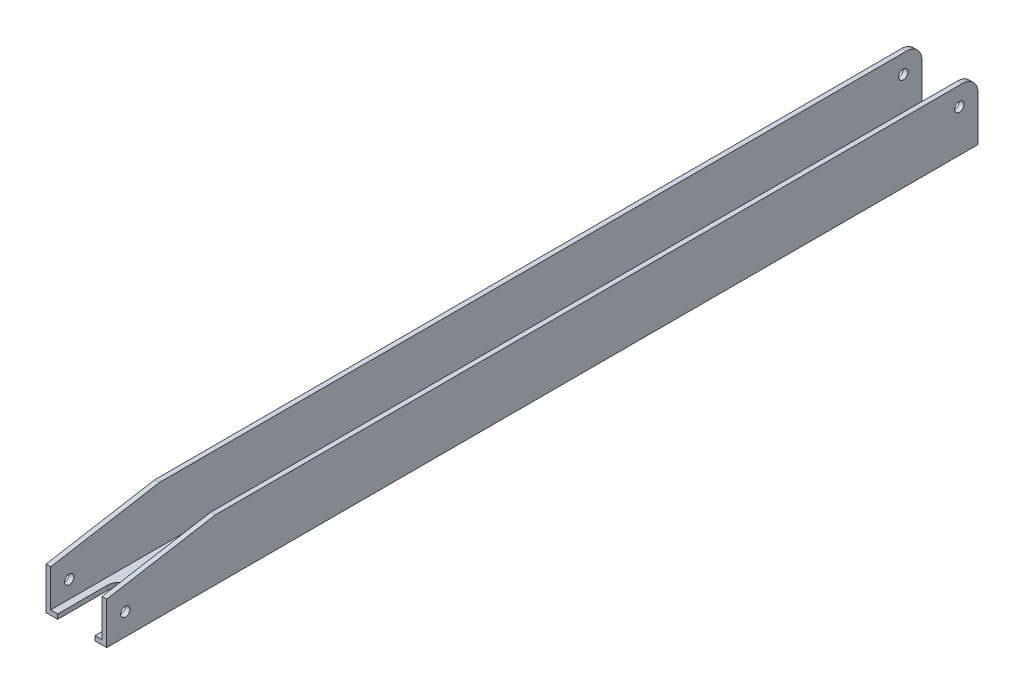
ISO-10303-21;
HEADER;
FILE_DESCRIPTION(('STEP AP214'),'2;1');
FILE_NAME('part.step','',(''),(''),'','','');
FILE_SCHEMA(('AUTOMOTIVE_DESIGN { 1 0 10303 214 1 1 1 1 }'));
ENDSEC;
DATA;
#1=APPLICATION_CONTEXT('core data for automotive mechanical design processes');
#2=APPLICATION_PROTOCOL_DEFINITION('international standard','automotive_design',2000,#1);
#3=PRODUCT_CONTEXT('',#1,'mechanical');
#4=PRODUCT('Part','Part','',(#3));
#5=PRODUCT_RELATED_PRODUCT_CATEGORY('part','',(#4));
#6=PRODUCT_DEFINITION_FORMATION('','',#4);
#7=PRODUCT_DEFINITION_CONTEXT('part definition',#1,'design');
#8=PRODUCT_DEFINITION('design','',#6,#7);
#9=PRODUCT_DEFINITION_SHAPE('','',#8);
#10=(LENGTH_UNIT() NAMED_UNIT(*) SI_UNIT(.MILLI.,.METRE.));
#11=(NAMED_UNIT(*) PLANE_ANGLE_UNIT() SI_UNIT($,.RADIAN.));
#12=(NAMED_UNIT(*) SI_UNIT($,.STERADIAN.) SOLID_ANGLE_UNIT());
#13=UNCERTAINTY_MEASURE_WITH_UNIT(LENGTH_MEASURE(1.E-05),#10,'distance_accuracy_value','');
#14=(GEOMETRIC_REPRESENTATION_CONTEXT(3) GLOBAL_UNCERTAINTY_ASSIGNED_CONTEXT((#13)) GLOBAL_UNIT_ASSIGNED_CONTEXT((#10,
#11,#12)) REPRESENTATION_CONTEXT('',''));
#15=CARTESIAN_POINT('',(0.,0.,0.));
#16=DIRECTION('',(0.,0.,1.));
#17=DIRECTION('',(1.,0.,0.));
#18=AXIS2_PLACEMENT_3D('',#15,#16,#17);
#19=CARTESIAN_POINT('',(0.,0.,280.));
#20=DIRECTION('',(0.,0.,-1.));
#21=DIRECTION('',(-1.,0.,0.));
#22=AXIS2_PLACEMENT_3D('',#19,#20,#21);
#23=PLANE('',#22);
#24=DIRECTION('',(0.,-1.,0.));
#25=VECTOR('',#24,1.);
#26=CARTESIAN_POINT('',(-8.25,19.5,280.));
#27=LINE('',#26,#25);
#28=CARTESIAN_POINT('',(-8.25,13.5,280.));
#29=VERTEX_POINT('',#28);
#30=CARTESIAN_POINT('',(-8.25,1.5,280.));
#31=VERTEX_POINT('',#30);
#32=EDGE_CURVE('E177',#29,#31,#27,.T.);
#33=ORIENTED_EDGE('',*,*,#32,.F.);
#34=DIRECTION('',(1.,0.,0.));
#35=VECTOR('',#34,1.);
#36=CARTESIAN_POINT('',(-9.75,13.5,280.));
#37=LINE('',#36,#35);
#38=CARTESIAN_POINT('',(-9.75,13.5,280.));
#39=VERTEX_POINT('',#38);
#40=EDGE_CURVE('E160',#39,#29,#37,.T.);
#41=ORIENTED_EDGE('',*,*,#40,.F.);
#42=DIRECTION('',(0.,-1.,0.));
#43=VECTOR('',#42,1.);
#44=CARTESIAN_POINT('',(-9.75,19.5,280.));
#45=LINE('',#44,#43);
#46=CARTESIAN_POINT('',(-9.75,0.,280.));
#47=VERTEX_POINT('',#46);
#48=EDGE_CURVE('E174',#39,#47,#45,.T.);
#49=ORIENTED_EDGE('',*,*,#48,.T.);
#50=DIRECTION('',(1.,0.,0.));
#51=VECTOR('',#50,1.);
#52=CARTESIAN_POINT('',(-9.75,0.,280.));
#53=LINE('',#52,#51);
#54=CARTESIAN_POINT('',(-6.,0.,280.));
#55=VERTEX_POINT('',#54);
#56=EDGE_CURVE('E186',#47,#55,#53,.T.);
#57=ORIENTED_EDGE('',*,*,#56,.T.);
#58=DIRECTION('',(0.,1.,0.));
#59=VECTOR('',#58,1.);
#60=CARTESIAN_POINT('',(-6.,0.,280.));
#61=LINE('',#60,#59);
#62=CARTESIAN_POINT('',(-6.,1.5,280.));
#63=VERTEX_POINT('',#62);
#64=EDGE_CURVE('E229',#55,#63,#61,.T.);
#65=ORIENTED_EDGE('',*,*,#64,.T.);
#66=DIRECTION('',(1.,0.,0.));
#67=VECTOR('',#66,1.);
#68=CARTESIAN_POINT('',(-9.75,1.5,280.));
#69=LINE('',#68,#67);
#70=EDGE_CURVE('E188',#31,#63,#69,.T.);
#71=ORIENTED_EDGE('',*,*,#70,.F.);
#72=EDGE_LOOP('',(#33,#41,#49,#57,#65,#71));
#73=FACE_BOUND('',#72,.T.);
#74=ADVANCED_FACE('F33',(#73),#23,.F.);
#75=CARTESIAN_POINT('',(9.75,0.,280.));
#76=DIRECTION('',(-1.,0.,0.));
#77=DIRECTION('',(0.,-1.,0.));
#78=AXIS2_PLACEMENT_3D('',#75,#76,#77);
#79=PLANE('',#78);
#80=CARTESIAN_POINT('',(9.75,7.,274.));
#81=DIRECTION('',(1.,0.,0.));
#82=DIRECTION('',(0.,1.,0.));
#83=AXIS2_PLACEMENT_3D('',#80,#81,#82);
#84=CIRCLE('',#83,1.50000000000002);
#85=CARTESIAN_POINT('',(9.75,8.50000000000002,274.));
#86=VERTEX_POINT('',#85);
#87=EDGE_CURVE('E178',#86,#86,#84,.T.);
#88=ORIENTED_EDGE('',*,*,#87,.F.);
#89=EDGE_LOOP('',(#88));
#90=FACE_BOUND('',#89,.T.);
#91=CARTESIAN_POINT('',(9.75,13.5,6.));
#92=DIRECTION('',(1.,0.,0.));
#93=DIRECTION('',(0.,1.,0.));
#94=AXIS2_PLACEMENT_3D('',#91,#92,#93);
#95=CIRCLE('',#94,1.5);
#96=CARTESIAN_POINT('',(9.75,15.,6.));
#97=VERTEX_POINT('',#96);
#98=EDGE_CURVE('E271',#97,#97,#95,.T.);
#99=ORIENTED_EDGE('',*,*,#98,.F.);
#100=EDGE_LOOP('',(#99));
#101=FACE_BOUND('',#100,.T.);
#102=DIRECTION('',(0.,1.,0.));
#103=VECTOR('',#102,1.);
#104=CARTESIAN_POINT('',(9.75,0.,0.));
#105=LINE('',#104,#103);
#106=CARTESIAN_POINT('',(9.75,0.,0.));
#107=VERTEX_POINT('',#106);
#108=CARTESIAN_POINT('',(9.75,14.5,0.));
#109=VERTEX_POINT('',#108);
#110=EDGE_CURVE('E193',#107,#109,#105,.T.);
#111=ORIENTED_EDGE('',*,*,#110,.T.);
#112=CARTESIAN_POINT('',(9.75,14.5,5.));
#113=DIRECTION('',(-1.,0.,0.));
#114=DIRECTION('',(0.,-1.,0.));
#115=AXIS2_PLACEMENT_3D('',#112,#113,#114);
#116=CIRCLE('',#115,5.);
#117=CARTESIAN_POINT('',(9.75,19.5,5.));
#118=VERTEX_POINT('',#117);
#119=EDGE_CURVE('E55',#109,#118,#116,.F.);
#120=ORIENTED_EDGE('',*,*,#119,.T.);
#121=DIRECTION('',(0.,0.,-1.));
#122=VECTOR('',#121,1.);
#123=CARTESIAN_POINT('',(9.75,19.5,280.));
#124=LINE('',#123,#122);
#125=CARTESIAN_POINT('',(9.75,19.5,245.));
#126=VERTEX_POINT('',#125);
#127=EDGE_CURVE('E224',#126,#118,#124,.T.);
#128=ORIENTED_EDGE('',*,*,#127,.F.);
#129=DIRECTION('',(0.,0.168963815110846,-0.985622254813267));
#130=VECTOR('',#129,1.);
#131=CARTESIAN_POINT('',(9.75,19.5,245.));
#132=LINE('',#131,#130);
#133=CARTESIAN_POINT('',(9.75,13.5,280.));
#134=VERTEX_POINT('',#133);
#135=EDGE_CURVE('E169',#134,#126,#132,.T.);
#136=ORIENTED_EDGE('',*,*,#135,.F.);
#137=DIRECTION('',(0.,1.,0.));
#138=VECTOR('',#137,1.);
#139=CARTESIAN_POINT('',(9.75,0.,280.));
#140=LINE('',#139,#138);
#141=CARTESIAN_POINT('',(9.75,0.,280.));
#142=VERTEX_POINT('',#141);
#143=EDGE_CURVE('E208',#142,#134,#140,.T.);
#144=ORIENTED_EDGE('',*,*,#143,.F.);
#145=DIRECTION('',(0.,0.,-1.));
#146=VECTOR('',#145,1.);
#147=CARTESIAN_POINT('',(9.75,0.,280.));
#148=LINE('',#147,#146);
#149=EDGE_CURVE('E192',#142,#107,#148,.T.);
#150=ORIENTED_EDGE('',*,*,#149,.T.);
#151=EDGE_LOOP('',(#111,#120,#128,#136,#144,#150));
#152=FACE_BOUND('',#151,.T.);
#153=ADVANCED_FACE('F374',(#90,#101,#152),#79,.F.);
#154=CARTESIAN_POINT('',(8.25,19.5,280.));
#155=DIRECTION('',(0.,1.,0.));
#156=DIRECTION('',(0.,0.,1.));
#157=AXIS2_PLACEMENT_3D('',#154,#155,#156);
#158=PLANE('',#157);
#159=ORIENTED_EDGE('',*,*,#127,.T.);
#160=DIRECTION('',(1.,0.,0.));
#161=VECTOR('',#160,1.);
#162=CARTESIAN_POINT('',(8.25,19.5,5.));
#163=LINE('',#162,#161);
#164=CARTESIAN_POINT('',(8.25,19.5,5.));
#165=VERTEX_POINT('',#164);
#166=EDGE_CURVE('E41',#118,#165,#163,.F.);
#167=ORIENTED_EDGE('',*,*,#166,.T.);
#168=DIRECTION('',(0.,0.,-1.));
#169=VECTOR('',#168,1.);
#170=CARTESIAN_POINT('',(8.25,19.5,280.));
#171=LINE('',#170,#169);
#172=CARTESIAN_POINT('',(8.25,19.5,245.));
#173=VERTEX_POINT('',#172);
#174=EDGE_CURVE('E222',#173,#165,#171,.T.);
#175=ORIENTED_EDGE('',*,*,#174,.F.);
#176=DIRECTION('',(1.,0.,0.));
#177=VECTOR('',#176,1.);
#178=CARTESIAN_POINT('',(-9.75,19.5,245.));
#179=LINE('',#178,#177);
#180=EDGE_CURVE('E168',#173,#126,#179,.T.);
#181=ORIENTED_EDGE('',*,*,#180,.T.);
#182=EDGE_LOOP('',(#159,#167,#175,#181));
#183=FACE_BOUND('',#182,.T.);
#184=ADVANCED_FACE('F404',(#183),#158,.T.);
#185=CARTESIAN_POINT('',(8.25,0.,280.));
#186=DIRECTION('',(-1.,0.,0.));
#187=DIRECTION('',(0.,-1.,0.));
#188=AXIS2_PLACEMENT_3D('',#185,#186,#187);
#189=PLANE('',#188);
#190=CARTESIAN_POINT('',(8.25,7.,274.));
#191=DIRECTION('',(-1.,0.,0.));
#192=DIRECTION('',(0.,-1.,0.));
#193=AXIS2_PLACEMENT_3D('',#190,#191,#192);
#194=CIRCLE('',#193,1.50000000000002);
#195=CARTESIAN_POINT('',(8.25,5.49999999999997,274.));
#196=VERTEX_POINT('',#195);
#197=EDGE_CURVE('E288',#196,#196,#194,.T.);
#198=ORIENTED_EDGE('',*,*,#197,.F.);
#199=EDGE_LOOP('',(#198));
#200=FACE_BOUND('',#199,.T.);
#201=ORIENTED_EDGE('',*,*,#174,.T.);
#202=CARTESIAN_POINT('',(8.25,14.5,5.));
#203=DIRECTION('',(-1.,0.,0.));
#204=DIRECTION('',(0.,-1.,0.));
#205=AXIS2_PLACEMENT_3D('',#202,#203,#204);
#206=CIRCLE('',#205,5.);
#207=CARTESIAN_POINT('',(8.25,14.5,0.));
#208=VERTEX_POINT('',#207);
#209=EDGE_CURVE('E11',#165,#208,#206,.T.);
#210=ORIENTED_EDGE('',*,*,#209,.T.);
#211=DIRECTION('',(0.,1.,0.));
#212=VECTOR('',#211,1.);
#213=CARTESIAN_POINT('',(8.25,0.,0.));
#214=LINE('',#213,#212);
#215=CARTESIAN_POINT('',(8.25,1.5,0.));
#216=VERTEX_POINT('',#215);
#217=EDGE_CURVE('E195',#216,#208,#214,.T.);
#218=ORIENTED_EDGE('',*,*,#217,.F.);
#219=DIRECTION('',(0.,0.,-1.));
#220=VECTOR('',#219,1.);
#221=CARTESIAN_POINT('',(8.25,1.5,280.));
#222=LINE('',#221,#220);
#223=CARTESIAN_POINT('',(8.25,1.5,280.));
#224=VERTEX_POINT('',#223);
#225=EDGE_CURVE('E220',#224,#216,#222,.T.);
#226=ORIENTED_EDGE('',*,*,#225,.F.);
#227=DIRECTION('',(0.,1.,0.));
#228=VECTOR('',#227,1.);
#229=CARTESIAN_POINT('',(8.25,0.,280.));
#230=LINE('',#229,#228);
#231=CARTESIAN_POINT('',(8.25,13.5,280.));
#232=VERTEX_POINT('',#231);
#233=EDGE_CURVE('E348',#224,#232,#230,.T.);
#234=ORIENTED_EDGE('',*,*,#233,.T.);
#235=DIRECTION('',(0.,-0.168963815110846,0.985622254813267));
#236=VECTOR('',#235,1.);
#237=CARTESIAN_POINT('',(8.25,13.114591593973,282.248215701824));
#238=LINE('',#237,#236);
#239=EDGE_CURVE('E276',#173,#232,#238,.T.);
#240=ORIENTED_EDGE('',*,*,#239,.F.);
#241=EDGE_LOOP('',(#201,#210,#218,#226,#234,#240));
#242=FACE_BOUND('',#241,.T.);
#243=CARTESIAN_POINT('',(8.25,13.5,6.));
#244=DIRECTION('',(-1.,0.,0.));
#245=DIRECTION('',(0.,-1.,0.));
#246=AXIS2_PLACEMENT_3D('',#243,#244,#245);
#247=CIRCLE('',#246,1.5);
#248=CARTESIAN_POINT('',(8.25,12.,6.));
#249=VERTEX_POINT('',#248);
#250=EDGE_CURVE('E282',#249,#249,#247,.T.);
#251=ORIENTED_EDGE('',*,*,#250,.F.);
#252=EDGE_LOOP('',(#251));
#253=FACE_BOUND('',#252,.T.);
#254=ADVANCED_FACE('F366',(#200,#242,#253),#189,.T.);
#255=CARTESIAN_POINT('',(-9.75,1.5,280.));
#256=DIRECTION('',(0.,1.,0.));
#257=DIRECTION('',(0.,0.,1.));
#258=AXIS2_PLACEMENT_3D('',#255,#256,#257);
#259=PLANE('',#258);
#260=CARTESIAN_POINT('',(0.,1.5,174.));
#261=DIRECTION('',(0.,1.,0.));
#262=DIRECTION('',(0.,0.,1.));
#263=AXIS2_PLACEMENT_3D('',#260,#261,#262);
#264=CIRCLE('',#263,1.5);
#265=CARTESIAN_POINT('',(0.,1.5,175.5));
#266=VERTEX_POINT('',#265);
#267=EDGE_CURVE('E196',#266,#266,#264,.T.);
#268=ORIENTED_EDGE('',*,*,#267,.F.);
#269=EDGE_LOOP('',(#268));
#270=FACE_BOUND('',#269,.T.);
#271=CARTESIAN_POINT('',(0.,1.5,24.));
#272=DIRECTION('',(0.,1.,0.));
#273=DIRECTION('',(0.,0.,1.));
#274=AXIS2_PLACEMENT_3D('',#271,#272,#273);
#275=CIRCLE('',#274,1.5);
#276=CARTESIAN_POINT('',(0.,1.5,25.5));
#277=VERTEX_POINT('',#276);
#278=EDGE_CURVE('E341',#277,#277,#275,.T.);
#279=ORIENTED_EDGE('',*,*,#278,.F.);
#280=EDGE_LOOP('',(#279));
#281=FACE_BOUND('',#280,.T.);
#282=DIRECTION('',(0.,0.,1.));
#283=VECTOR('',#282,1.);
#284=CARTESIAN_POINT('',(-6.,1.5,280.));
#285=LINE('',#284,#283);
#286=CARTESIAN_POINT('',(-6.,1.5,264.));
#287=VERTEX_POINT('',#286);
#288=EDGE_CURVE('E327',#287,#63,#285,.T.);
#289=ORIENTED_EDGE('',*,*,#288,.F.);
#290=CARTESIAN_POINT('',(-2.,1.5,264.));
#291=DIRECTION('',(0.,1.,0.));
#292=DIRECTION('',(0.,0.,1.));
#293=AXIS2_PLACEMENT_3D('',#290,#291,#292);
#294=CIRCLE('',#293,4.);
#295=CARTESIAN_POINT('',(-2.,1.5,260.));
#296=VERTEX_POINT('',#295);
#297=EDGE_CURVE('E335',#296,#287,#294,.T.);
#298=ORIENTED_EDGE('',*,*,#297,.F.);
#299=DIRECTION('',(-1.,0.,0.));
#300=VECTOR('',#299,1.);
#301=CARTESIAN_POINT('',(-9.75,1.5,260.));
#302=LINE('',#301,#300);
#303=CARTESIAN_POINT('',(2.,1.5,260.));
#304=VERTEX_POINT('',#303);
#305=EDGE_CURVE('E337',#304,#296,#302,.T.);
#306=ORIENTED_EDGE('',*,*,#305,.F.);
#307=CARTESIAN_POINT('',(2.,1.5,264.));
#308=DIRECTION('',(0.,1.,0.));
#309=DIRECTION('',(0.,0.,1.));
#310=AXIS2_PLACEMENT_3D('',#307,#308,#309);
#311=CIRCLE('',#310,4.);
#312=CARTESIAN_POINT('',(6.,1.5,264.));
#313=VERTEX_POINT('',#312);
#314=EDGE_CURVE('E339',#313,#304,#311,.T.);
#315=ORIENTED_EDGE('',*,*,#314,.F.);
#316=DIRECTION('',(0.,0.,-1.));
#317=VECTOR('',#316,1.);
#318=CARTESIAN_POINT('',(6.,1.5,280.));
#319=LINE('',#318,#317);
#320=CARTESIAN_POINT('',(6.,1.5,280.));
#321=VERTEX_POINT('',#320);
#322=EDGE_CURVE('E325',#321,#313,#319,.T.);
#323=ORIENTED_EDGE('',*,*,#322,.F.);
#324=EDGE_CURVE('E350',#321,#224,#69,.T.);
#325=ORIENTED_EDGE('',*,*,#324,.T.);
#326=ORIENTED_EDGE('',*,*,#225,.T.);
#327=DIRECTION('',(1.,0.,0.));
#328=VECTOR('',#327,1.);
#329=CARTESIAN_POINT('',(-9.75,1.5,0.));
#330=LINE('',#329,#328);
#331=CARTESIAN_POINT('',(-8.25,1.5,0.));
#332=VERTEX_POINT('',#331);
#333=EDGE_CURVE('E199',#332,#216,#330,.T.);
#334=ORIENTED_EDGE('',*,*,#333,.F.);
#335=DIRECTION('',(0.,0.,-1.));
#336=VECTOR('',#335,1.);
#337=CARTESIAN_POINT('',(-8.25,1.5,280.));
#338=LINE('',#337,#336);
#339=EDGE_CURVE('E217',#31,#332,#338,.T.);
#340=ORIENTED_EDGE('',*,*,#339,.F.);
#341=ORIENTED_EDGE('',*,*,#70,.T.);
#342=EDGE_LOOP('',(#289,#298,#306,#315,#323,#325,#326,#334,#340,#341));
#343=FACE_BOUND('',#342,.T.);
#344=CARTESIAN_POINT('',(0.,1.5,205.));
#345=DIRECTION('',(0.,1.,0.));
#346=DIRECTION('',(0.,0.,1.));
#347=AXIS2_PLACEMENT_3D('',#344,#345,#346);
#348=CIRCLE('',#347,1.5);
#349=CARTESIAN_POINT('',(0.,1.5,206.5));
#350=VERTEX_POINT('',#349);
#351=EDGE_CURVE('E332',#350,#350,#348,.T.);
#352=ORIENTED_EDGE('',*,*,#351,.F.);
#353=EDGE_LOOP('',(#352));
#354=FACE_BOUND('',#353,.T.);
#355=CARTESIAN_POINT('',(0.,1.5,223.));
#356=DIRECTION('',(0.,1.,0.));
#357=DIRECTION('',(0.,0.,1.));
#358=AXIS2_PLACEMENT_3D('',#355,#356,#357);
#359=CIRCLE('',#358,1.5);
#360=CARTESIAN_POINT('',(0.,1.5,224.5));
#361=VERTEX_POINT('',#360);
#362=EDGE_CURVE('E329',#361,#361,#359,.T.);
#363=ORIENTED_EDGE('',*,*,#362,.F.);
#364=EDGE_LOOP('',(#363));
#365=FACE_BOUND('',#364,.T.);
#366=ADVANCED_FACE('F358',(#270,#281,#343,#354,#365),#259,.T.);
#367=CARTESIAN_POINT('',(-8.25,19.5,280.));
#368=DIRECTION('',(1.,0.,0.));
#369=DIRECTION('',(0.,1.,0.));
#370=AXIS2_PLACEMENT_3D('',#367,#368,#369);
#371=PLANE('',#370);
#372=CARTESIAN_POINT('',(-8.25,7.,274.));
#373=DIRECTION('',(1.,0.,0.));
#374=DIRECTION('',(0.,1.,0.));
#375=AXIS2_PLACEMENT_3D('',#372,#373,#374);
#376=CIRCLE('',#375,1.50000000000002);
#377=CARTESIAN_POINT('',(-8.25,8.50000000000002,274.));
#378=VERTEX_POINT('',#377);
#379=EDGE_CURVE('E285',#378,#378,#376,.T.);
#380=ORIENTED_EDGE('',*,*,#379,.F.);
#381=EDGE_LOOP('',(#380));
#382=FACE_BOUND('',#381,.T.);
#383=DIRECTION('',(0.,-1.,0.));
#384=VECTOR('',#383,1.);
#385=CARTESIAN_POINT('',(-8.25,19.5,0.));
#386=LINE('',#385,#384);
#387=CARTESIAN_POINT('',(-8.25,14.5,0.));
#388=VERTEX_POINT('',#387);
#389=EDGE_CURVE('E202',#388,#332,#386,.T.);
#390=ORIENTED_EDGE('',*,*,#389,.F.);
#391=CARTESIAN_POINT('',(-8.25,14.5,5.));
#392=DIRECTION('',(1.,0.,0.));
#393=DIRECTION('',(0.,1.,0.));
#394=AXIS2_PLACEMENT_3D('',#391,#392,#393);
#395=CIRCLE('',#394,5.);
#396=CARTESIAN_POINT('',(-8.25,19.5,5.));
#397=VERTEX_POINT('',#396);
#398=EDGE_CURVE('E241',#388,#397,#395,.T.);
#399=ORIENTED_EDGE('',*,*,#398,.T.);
#400=DIRECTION('',(0.,0.,-1.));
#401=VECTOR('',#400,1.);
#402=CARTESIAN_POINT('',(-8.25,19.5,280.));
#403=LINE('',#402,#401);
#404=CARTESIAN_POINT('',(-8.25,19.5,245.));
#405=VERTEX_POINT('',#404);
#406=EDGE_CURVE('E214',#405,#397,#403,.T.);
#407=ORIENTED_EDGE('',*,*,#406,.F.);
#408=DIRECTION('',(0.,0.168963815110846,-0.985622254813267));
#409=VECTOR('',#408,1.);
#410=CARTESIAN_POINT('',(-8.25,13.6712926249009,279.000793021412));
#411=LINE('',#410,#409);
#412=EDGE_CURVE('E274',#29,#405,#411,.T.);
#413=ORIENTED_EDGE('',*,*,#412,.F.);
#414=ORIENTED_EDGE('',*,*,#32,.T.);
#415=ORIENTED_EDGE('',*,*,#339,.T.);
#416=EDGE_LOOP('',(#390,#399,#407,#413,#414,#415));
#417=FACE_BOUND('',#416,.T.);
#418=CARTESIAN_POINT('',(-8.25,13.5,6.));
#419=DIRECTION('',(1.,0.,0.));
#420=DIRECTION('',(0.,1.,0.));
#421=AXIS2_PLACEMENT_3D('',#418,#419,#420);
#422=CIRCLE('',#421,1.5);
#423=CARTESIAN_POINT('',(-8.25,15.,6.));
#424=VERTEX_POINT('',#423);
#425=EDGE_CURVE('E279',#424,#424,#422,.T.);
#426=ORIENTED_EDGE('',*,*,#425,.F.);
#427=EDGE_LOOP('',(#426));
#428=FACE_BOUND('',#427,.T.);
#429=ADVANCED_FACE('F260',(#382,#417,#428),#371,.T.);
#430=CARTESIAN_POINT('',(-9.75,19.5,280.));
#431=DIRECTION('',(0.,1.,0.));
#432=DIRECTION('',(0.,0.,1.));
#433=AXIS2_PLACEMENT_3D('',#430,#431,#432);
#434=PLANE('',#433);
#435=ORIENTED_EDGE('',*,*,#406,.T.);
#436=DIRECTION('',(1.,0.,0.));
#437=VECTOR('',#436,1.);
#438=CARTESIAN_POINT('',(-9.75,19.5,5.));
#439=LINE('',#438,#437);
#440=CARTESIAN_POINT('',(-9.75,19.5,5.));
#441=VERTEX_POINT('',#440);
#442=EDGE_CURVE('E243',#397,#441,#439,.F.);
#443=ORIENTED_EDGE('',*,*,#442,.T.);
#444=DIRECTION('',(0.,0.,-1.));
#445=VECTOR('',#444,1.);
#446=CARTESIAN_POINT('',(-9.75,19.5,280.));
#447=LINE('',#446,#445);
#448=CARTESIAN_POINT('',(-9.75,19.5,245.));
#449=VERTEX_POINT('',#448);
#450=EDGE_CURVE('E212',#449,#441,#447,.T.);
#451=ORIENTED_EDGE('',*,*,#450,.F.);
#452=EDGE_CURVE('E163',#449,#405,#179,.T.);
#453=ORIENTED_EDGE('',*,*,#452,.T.);
#454=EDGE_LOOP('',(#435,#443,#451,#453));
#455=FACE_BOUND('',#454,.T.);
#456=ADVANCED_FACE('F263',(#455),#434,.T.);
#457=CARTESIAN_POINT('',(-9.75,19.5,280.));
#458=DIRECTION('',(1.,0.,0.));
#459=DIRECTION('',(0.,1.,0.));
#460=AXIS2_PLACEMENT_3D('',#457,#458,#459);
#461=PLANE('',#460);
#462=CARTESIAN_POINT('',(-9.75,7.,274.));
#463=DIRECTION('',(1.,0.,0.));
#464=DIRECTION('',(0.,1.,0.));
#465=AXIS2_PLACEMENT_3D('',#462,#463,#464);
#466=CIRCLE('',#465,1.50000000000002);
#467=CARTESIAN_POINT('',(-9.75,8.50000000000002,274.));
#468=VERTEX_POINT('',#467);
#469=EDGE_CURVE('E277',#468,#468,#466,.T.);
#470=ORIENTED_EDGE('',*,*,#469,.T.);
#471=EDGE_LOOP('',(#470));
#472=FACE_BOUND('',#471,.T.);
#473=CARTESIAN_POINT('',(-9.75,13.5,6.));
#474=DIRECTION('',(1.,0.,0.));
#475=DIRECTION('',(0.,1.,0.));
#476=AXIS2_PLACEMENT_3D('',#473,#474,#475);
#477=CIRCLE('',#476,1.5);
#478=CARTESIAN_POINT('',(-9.75,15.,6.));
#479=VERTEX_POINT('',#478);
#480=EDGE_CURVE('E268',#479,#479,#477,.T.);
#481=ORIENTED_EDGE('',*,*,#480,.T.);
#482=EDGE_LOOP('',(#481));
#483=FACE_BOUND('',#482,.T.);
#484=ORIENTED_EDGE('',*,*,#450,.T.);
#485=CARTESIAN_POINT('',(-9.75,14.5,5.));
#486=DIRECTION('',(1.,0.,0.));
#487=DIRECTION('',(0.,1.,0.));
#488=AXIS2_PLACEMENT_3D('',#485,#486,#487);
#489=CIRCLE('',#488,5.);
#490=CARTESIAN_POINT('',(-9.75,14.5,0.));
#491=VERTEX_POINT('',#490);
#492=EDGE_CURVE('E245',#441,#491,#489,.F.);
#493=ORIENTED_EDGE('',*,*,#492,.T.);
#494=DIRECTION('',(0.,-1.,0.));
#495=VECTOR('',#494,1.);
#496=CARTESIAN_POINT('',(-9.75,19.5,0.));
#497=LINE('',#496,#495);
#498=CARTESIAN_POINT('',(-9.75,0.,0.));
#499=VERTEX_POINT('',#498);
#500=EDGE_CURVE('E204',#491,#499,#497,.T.);
#501=ORIENTED_EDGE('',*,*,#500,.T.);
#502=DIRECTION('',(0.,0.,-1.));
#503=VECTOR('',#502,1.);
#504=CARTESIAN_POINT('',(-9.75,0.,280.));
#505=LINE('',#504,#503);
#506=EDGE_CURVE('E182',#47,#499,#505,.T.);
#507=ORIENTED_EDGE('',*,*,#506,.F.);
#508=ORIENTED_EDGE('',*,*,#48,.F.);
#509=DIRECTION('',(0.,0.168963815110846,-0.985622254813267));
#510=VECTOR('',#509,1.);
#511=CARTESIAN_POINT('',(-9.75,19.5,245.));
#512=LINE('',#511,#510);
#513=EDGE_CURVE('E157',#39,#449,#512,.T.);
#514=ORIENTED_EDGE('',*,*,#513,.T.);
#515=EDGE_LOOP('',(#484,#493,#501,#507,#508,#514));
#516=FACE_BOUND('',#515,.T.);
#517=ADVANCED_FACE('F180',(#472,#483,#516),#461,.F.);
#518=CARTESIAN_POINT('',(-9.75,0.,280.));
#519=DIRECTION('',(0.,1.,0.));
#520=DIRECTION('',(0.,0.,1.));
#521=AXIS2_PLACEMENT_3D('',#518,#519,#520);
#522=PLANE('',#521);
#523=CARTESIAN_POINT('',(0.,0.,174.));
#524=DIRECTION('',(0.,-1.,0.));
#525=DIRECTION('',(0.,0.,-1.));
#526=AXIS2_PLACEMENT_3D('',#523,#524,#525);
#527=CIRCLE('',#526,1.5);
#528=CARTESIAN_POINT('',(0.,0.,172.5));
#529=VERTEX_POINT('',#528);
#530=EDGE_CURVE('E291',#529,#529,#527,.T.);
#531=ORIENTED_EDGE('',*,*,#530,.F.);
#532=EDGE_LOOP('',(#531));
#533=FACE_BOUND('',#532,.T.);
#534=CARTESIAN_POINT('',(0.,0.,24.));
#535=DIRECTION('',(0.,-1.,0.));
#536=DIRECTION('',(0.,0.,-1.));
#537=AXIS2_PLACEMENT_3D('',#534,#535,#536);
#538=CIRCLE('',#537,1.5);
#539=CARTESIAN_POINT('',(0.,0.,22.5));
#540=VERTEX_POINT('',#539);
#541=EDGE_CURVE('E301',#540,#540,#538,.T.);
#542=ORIENTED_EDGE('',*,*,#541,.F.);
#543=EDGE_LOOP('',(#542));
#544=FACE_BOUND('',#543,.T.);
#545=CARTESIAN_POINT('',(0.,0.,205.));
#546=DIRECTION('',(0.,-1.,0.));
#547=DIRECTION('',(0.,0.,-1.));
#548=AXIS2_PLACEMENT_3D('',#545,#546,#547);
#549=CIRCLE('',#548,1.5);
#550=CARTESIAN_POINT('',(0.,0.,203.5));
#551=VERTEX_POINT('',#550);
#552=EDGE_CURVE('E292',#551,#551,#549,.T.);
#553=ORIENTED_EDGE('',*,*,#552,.F.);
#554=EDGE_LOOP('',(#553));
#555=FACE_BOUND('',#554,.T.);
#556=CARTESIAN_POINT('',(0.,0.,223.));
#557=DIRECTION('',(0.,-1.,0.));
#558=DIRECTION('',(0.,0.,-1.));
#559=AXIS2_PLACEMENT_3D('',#556,#557,#558);
#560=CIRCLE('',#559,1.5);
#561=CARTESIAN_POINT('',(0.,0.,221.5));
#562=VERTEX_POINT('',#561);
#563=EDGE_CURVE('E295',#562,#562,#560,.T.);
#564=ORIENTED_EDGE('',*,*,#563,.F.);
#565=EDGE_LOOP('',(#564));
#566=FACE_BOUND('',#565,.T.);
#567=CARTESIAN_POINT('',(-2.,0.,264.));
#568=DIRECTION('',(0.,-1.,0.));
#569=DIRECTION('',(0.,0.,-1.));
#570=AXIS2_PLACEMENT_3D('',#567,#568,#569);
#571=CIRCLE('',#570,4.);
#572=CARTESIAN_POINT('',(-6.,0.,264.));
#573=VERTEX_POINT('',#572);
#574=CARTESIAN_POINT('',(-2.,0.,260.));
#575=VERTEX_POINT('',#574);
#576=EDGE_CURVE('E300',#573,#575,#571,.T.);
#577=ORIENTED_EDGE('',*,*,#576,.F.);
#578=DIRECTION('',(0.,0.,-1.));
#579=VECTOR('',#578,1.);
#580=CARTESIAN_POINT('',(-6.,0.,280.));
#581=LINE('',#580,#579);
#582=EDGE_CURVE('E297',#55,#573,#581,.T.);
#583=ORIENTED_EDGE('',*,*,#582,.F.);
#584=ORIENTED_EDGE('',*,*,#56,.F.);
#585=ORIENTED_EDGE('',*,*,#506,.T.);
#586=DIRECTION('',(1.,0.,0.));
#587=VECTOR('',#586,1.);
#588=CARTESIAN_POINT('',(-9.75,0.,0.));
#589=LINE('',#588,#587);
#590=EDGE_CURVE('E206',#499,#107,#589,.T.);
#591=ORIENTED_EDGE('',*,*,#590,.T.);
#592=ORIENTED_EDGE('',*,*,#149,.F.);
#593=CARTESIAN_POINT('',(6.,0.,280.));
#594=VERTEX_POINT('',#593);
#595=EDGE_CURVE('E184',#594,#142,#53,.T.);
#596=ORIENTED_EDGE('',*,*,#595,.F.);
#597=DIRECTION('',(0.,0.,1.));
#598=VECTOR('',#597,1.);
#599=CARTESIAN_POINT('',(6.,0.,280.));
#600=LINE('',#599,#598);
#601=CARTESIAN_POINT('',(6.,0.,264.));
#602=VERTEX_POINT('',#601);
#603=EDGE_CURVE('E310',#602,#594,#600,.T.);
#604=ORIENTED_EDGE('',*,*,#603,.F.);
#605=CARTESIAN_POINT('',(2.,0.,264.));
#606=DIRECTION('',(0.,-1.,0.));
#607=DIRECTION('',(0.,0.,-1.));
#608=AXIS2_PLACEMENT_3D('',#605,#606,#607);
#609=CIRCLE('',#608,4.);
#610=CARTESIAN_POINT('',(2.,0.,260.));
#611=VERTEX_POINT('',#610);
#612=EDGE_CURVE('E307',#611,#602,#609,.T.);
#613=ORIENTED_EDGE('',*,*,#612,.F.);
#614=DIRECTION('',(1.,0.,0.));
#615=VECTOR('',#614,1.);
#616=CARTESIAN_POINT('',(-2.,0.,260.));
#617=LINE('',#616,#615);
#618=EDGE_CURVE('E304',#575,#611,#617,.T.);
#619=ORIENTED_EDGE('',*,*,#618,.F.);
#620=EDGE_LOOP('',(#577,#583,#584,#585,#591,#592,#596,#604,#613,#619));
#621=FACE_BOUND('',#620,.T.);
#622=ADVANCED_FACE('F410',(#533,#544,#555,#566,#621),#522,.F.);
#623=ORIENTED_EDGE('',*,*,#143,.T.);
#624=DIRECTION('',(-1.,0.,0.));
#625=VECTOR('',#624,1.);
#626=CARTESIAN_POINT('',(0.,13.5,280.));
#627=LINE('',#626,#625);
#628=EDGE_CURVE('E232',#134,#232,#627,.T.);
#629=ORIENTED_EDGE('',*,*,#628,.T.);
#630=ORIENTED_EDGE('',*,*,#233,.F.);
#631=ORIENTED_EDGE('',*,*,#324,.F.);
#632=DIRECTION('',(0.,-1.,0.));
#633=VECTOR('',#632,1.);
#634=CARTESIAN_POINT('',(6.,0.,280.));
#635=LINE('',#634,#633);
#636=EDGE_CURVE('E226',#321,#594,#635,.T.);
#637=ORIENTED_EDGE('',*,*,#636,.T.);
#638=ORIENTED_EDGE('',*,*,#595,.T.);
#639=EDGE_LOOP('',(#623,#629,#630,#631,#637,#638));
#640=FACE_BOUND('',#639,.T.);
#641=ADVANCED_FACE('F369',(#640),#23,.F.);
#642=CARTESIAN_POINT('',(0.,0.,0.));
#643=DIRECTION('',(0.,0.,-1.));
#644=DIRECTION('',(-1.,0.,0.));
#645=AXIS2_PLACEMENT_3D('',#642,#643,#644);
#646=PLANE('',#645);
#647=ORIENTED_EDGE('',*,*,#500,.F.);
#648=DIRECTION('',(1.,0.,0.));
#649=VECTOR('',#648,1.);
#650=CARTESIAN_POINT('',(0.,14.5,0.));
#651=LINE('',#650,#649);
#652=EDGE_CURVE('E238',#491,#388,#651,.T.);
#653=ORIENTED_EDGE('',*,*,#652,.T.);
#654=ORIENTED_EDGE('',*,*,#389,.T.);
#655=ORIENTED_EDGE('',*,*,#333,.T.);
#656=ORIENTED_EDGE('',*,*,#217,.T.);
#657=DIRECTION('',(1.,0.,0.));
#658=VECTOR('',#657,1.);
#659=CARTESIAN_POINT('',(0.,14.5,0.));
#660=LINE('',#659,#658);
#661=EDGE_CURVE('E235',#208,#109,#660,.T.);
#662=ORIENTED_EDGE('',*,*,#661,.T.);
#663=ORIENTED_EDGE('',*,*,#110,.F.);
#664=ORIENTED_EDGE('',*,*,#590,.F.);
#665=EDGE_LOOP('',(#647,#653,#654,#655,#656,#662,#663,#664));
#666=FACE_BOUND('',#665,.T.);
#667=ADVANCED_FACE('F254',(#666),#646,.T.);
#668=CARTESIAN_POINT('',(-6.,19.5,280.));
#669=DIRECTION('',(-1.,0.,0.));
#670=DIRECTION('',(0.,0.,1.));
#671=AXIS2_PLACEMENT_3D('',#668,#669,#670);
#672=PLANE('',#671);
#673=ORIENTED_EDGE('',*,*,#288,.T.);
#674=ORIENTED_EDGE('',*,*,#64,.F.);
#675=ORIENTED_EDGE('',*,*,#582,.T.);
#676=DIRECTION('',(0.,-1.,0.));
#677=VECTOR('',#676,1.);
#678=CARTESIAN_POINT('',(-6.,19.5,264.));
#679=LINE('',#678,#677);
#680=EDGE_CURVE('E312',#287,#573,#679,.T.);
#681=ORIENTED_EDGE('',*,*,#680,.F.);
#682=EDGE_LOOP('',(#673,#674,#675,#681));
#683=FACE_BOUND('',#682,.T.);
#684=ADVANCED_FACE('F415',(#683),#672,.F.);
#685=CARTESIAN_POINT('',(6.,19.5,280.));
#686=DIRECTION('',(1.,0.,0.));
#687=DIRECTION('',(0.,0.,-1.));
#688=AXIS2_PLACEMENT_3D('',#685,#686,#687);
#689=PLANE('',#688);
#690=ORIENTED_EDGE('',*,*,#322,.T.);
#691=DIRECTION('',(0.,-1.,0.));
#692=VECTOR('',#691,1.);
#693=CARTESIAN_POINT('',(6.,19.5,264.));
#694=LINE('',#693,#692);
#695=EDGE_CURVE('E296',#313,#602,#694,.T.);
#696=ORIENTED_EDGE('',*,*,#695,.T.);
#697=ORIENTED_EDGE('',*,*,#603,.T.);
#698=ORIENTED_EDGE('',*,*,#636,.F.);
#699=EDGE_LOOP('',(#690,#696,#697,#698));
#700=FACE_BOUND('',#699,.T.);
#701=ADVANCED_FACE('F466',(#700),#689,.F.);
#702=CARTESIAN_POINT('',(2.,19.5,264.));
#703=DIRECTION('',(0.,-1.,0.));
#704=DIRECTION('',(0.,0.,-1.));
#705=AXIS2_PLACEMENT_3D('',#702,#703,#704);
#706=CYLINDRICAL_SURFACE('',#705,4.);
#707=ORIENTED_EDGE('',*,*,#314,.T.);
#708=DIRECTION('',(0.,-1.,0.));
#709=VECTOR('',#708,1.);
#710=CARTESIAN_POINT('',(2.,19.5,260.));
#711=LINE('',#710,#709);
#712=EDGE_CURVE('E314',#304,#611,#711,.T.);
#713=ORIENTED_EDGE('',*,*,#712,.T.);
#714=ORIENTED_EDGE('',*,*,#612,.T.);
#715=ORIENTED_EDGE('',*,*,#695,.F.);
#716=EDGE_LOOP('',(#707,#713,#714,#715));
#717=FACE_BOUND('',#716,.T.);
#718=ADVANCED_FACE('F462',(#717),#706,.F.);
#719=CARTESIAN_POINT('',(-2.,19.5,260.));
#720=DIRECTION('',(0.,0.,-1.));
#721=DIRECTION('',(-1.,0.,0.));
#722=AXIS2_PLACEMENT_3D('',#719,#720,#721);
#723=PLANE('',#722);
#724=ORIENTED_EDGE('',*,*,#305,.T.);
#725=DIRECTION('',(0.,-1.,0.));
#726=VECTOR('',#725,1.);
#727=CARTESIAN_POINT('',(-2.,19.5,260.));
#728=LINE('',#727,#726);
#729=EDGE_CURVE('E316',#296,#575,#728,.T.);
#730=ORIENTED_EDGE('',*,*,#729,.T.);
#731=ORIENTED_EDGE('',*,*,#618,.T.);
#732=ORIENTED_EDGE('',*,*,#712,.F.);
#733=EDGE_LOOP('',(#724,#730,#731,#732));
#734=FACE_BOUND('',#733,.T.);
#735=ADVANCED_FACE('F460',(#734),#723,.F.);
#736=CARTESIAN_POINT('',(-2.,19.5,264.));
#737=DIRECTION('',(0.,-1.,0.));
#738=DIRECTION('',(0.,0.,-1.));
#739=AXIS2_PLACEMENT_3D('',#736,#737,#738);
#740=CYLINDRICAL_SURFACE('',#739,4.);
#741=ORIENTED_EDGE('',*,*,#297,.T.);
#742=ORIENTED_EDGE('',*,*,#680,.T.);
#743=ORIENTED_EDGE('',*,*,#576,.T.);
#744=ORIENTED_EDGE('',*,*,#729,.F.);
#745=EDGE_LOOP('',(#741,#742,#743,#744));
#746=FACE_BOUND('',#745,.T.);
#747=ADVANCED_FACE('F455',(#746),#740,.F.);
#748=CARTESIAN_POINT('',(0.,19.5,223.));
#749=DIRECTION('',(0.,-1.,0.));
#750=DIRECTION('',(0.,0.,-1.));
#751=AXIS2_PLACEMENT_3D('',#748,#749,#750);
#752=CYLINDRICAL_SURFACE('',#751,1.5);
#753=ORIENTED_EDGE('',*,*,#362,.T.);
#754=EDGE_LOOP('',(#753));
#755=FACE_BOUND('',#754,.T.);
#756=ORIENTED_EDGE('',*,*,#563,.T.);
#757=EDGE_LOOP('',(#756));
#758=FACE_BOUND('',#757,.T.);
#759=ADVANCED_FACE('F483',(#755,#758),#752,.F.);
#760=CARTESIAN_POINT('',(0.,19.5,205.));
#761=DIRECTION('',(0.,-1.,0.));
#762=DIRECTION('',(0.,0.,-1.));
#763=AXIS2_PLACEMENT_3D('',#760,#761,#762);
#764=CYLINDRICAL_SURFACE('',#763,1.5);
#765=ORIENTED_EDGE('',*,*,#351,.T.);
#766=EDGE_LOOP('',(#765));
#767=FACE_BOUND('',#766,.T.);
#768=ORIENTED_EDGE('',*,*,#552,.T.);
#769=EDGE_LOOP('',(#768));
#770=FACE_BOUND('',#769,.T.);
#771=ADVANCED_FACE('F478',(#767,#770),#764,.F.);
#772=CARTESIAN_POINT('',(0.,19.5,24.));
#773=DIRECTION('',(0.,-1.,0.));
#774=DIRECTION('',(0.,0.,-1.));
#775=AXIS2_PLACEMENT_3D('',#772,#773,#774);
#776=CYLINDRICAL_SURFACE('',#775,1.5);
#777=ORIENTED_EDGE('',*,*,#278,.T.);
#778=EDGE_LOOP('',(#777));
#779=FACE_BOUND('',#778,.T.);
#780=ORIENTED_EDGE('',*,*,#541,.T.);
#781=EDGE_LOOP('',(#780));
#782=FACE_BOUND('',#781,.T.);
#783=ADVANCED_FACE('F485',(#779,#782),#776,.F.);
#784=CARTESIAN_POINT('',(0.,19.5,174.));
#785=DIRECTION('',(0.,-1.,0.));
#786=DIRECTION('',(0.,0.,-1.));
#787=AXIS2_PLACEMENT_3D('',#784,#785,#786);
#788=CYLINDRICAL_SURFACE('',#787,1.5);
#789=ORIENTED_EDGE('',*,*,#267,.T.);
#790=EDGE_LOOP('',(#789));
#791=FACE_BOUND('',#790,.T.);
#792=ORIENTED_EDGE('',*,*,#530,.T.);
#793=EDGE_LOOP('',(#792));
#794=FACE_BOUND('',#793,.T.);
#795=ADVANCED_FACE('F488',(#791,#794),#788,.F.);
#796=CARTESIAN_POINT('',(-9.75,19.5,245.));
#797=DIRECTION('',(0.,-0.985622254813267,-0.168963815110846));
#798=DIRECTION('',(0.,0.168963815110846,-0.985622254813267));
#799=AXIS2_PLACEMENT_3D('',#796,#797,#798);
#800=PLANE('',#799);
#801=ORIENTED_EDGE('',*,*,#239,.T.);
#802=ORIENTED_EDGE('',*,*,#628,.F.);
#803=ORIENTED_EDGE('',*,*,#135,.T.);
#804=ORIENTED_EDGE('',*,*,#180,.F.);
#805=EDGE_LOOP('',(#801,#802,#803,#804));
#806=FACE_BOUND('',#805,.T.);
#807=ADVANCED_FACE('F373',(#806),#800,.F.);
#808=CARTESIAN_POINT('',(-9.75,13.5,6.));
#809=DIRECTION('',(1.,0.,0.));
#810=DIRECTION('',(0.,1.,0.));
#811=AXIS2_PLACEMENT_3D('',#808,#809,#810);
#812=CYLINDRICAL_SURFACE('',#811,1.5);
#813=ORIENTED_EDGE('',*,*,#425,.T.);
#814=EDGE_LOOP('',(#813));
#815=FACE_BOUND('',#814,.T.);
#816=ORIENTED_EDGE('',*,*,#480,.F.);
#817=EDGE_LOOP('',(#816));
#818=FACE_BOUND('',#817,.T.);
#819=ADVANCED_FACE('F395',(#815,#818),#812,.F.);
#820=ORIENTED_EDGE('',*,*,#412,.T.);
#821=ORIENTED_EDGE('',*,*,#452,.F.);
#822=ORIENTED_EDGE('',*,*,#513,.F.);
#823=ORIENTED_EDGE('',*,*,#40,.T.);
#824=EDGE_LOOP('',(#820,#821,#822,#823));
#825=FACE_BOUND('',#824,.T.);
#826=ADVANCED_FACE('F159',(#825),#800,.F.);
#827=CARTESIAN_POINT('',(-9.75,7.,274.));
#828=DIRECTION('',(1.,0.,0.));
#829=DIRECTION('',(0.,1.,0.));
#830=AXIS2_PLACEMENT_3D('',#827,#828,#829);
#831=CYLINDRICAL_SURFACE('',#830,1.50000000000002);
#832=ORIENTED_EDGE('',*,*,#379,.T.);
#833=EDGE_LOOP('',(#832));
#834=FACE_BOUND('',#833,.T.);
#835=ORIENTED_EDGE('',*,*,#469,.F.);
#836=EDGE_LOOP('',(#835));
#837=FACE_BOUND('',#836,.T.);
#838=ADVANCED_FACE('F383',(#834,#837),#831,.F.);
#839=ORIENTED_EDGE('',*,*,#250,.T.);
#840=EDGE_LOOP('',(#839));
#841=FACE_BOUND('',#840,.T.);
#842=ORIENTED_EDGE('',*,*,#98,.T.);
#843=EDGE_LOOP('',(#842));
#844=FACE_BOUND('',#843,.T.);
#845=ADVANCED_FACE('F385',(#841,#844),#812,.F.);
#846=ORIENTED_EDGE('',*,*,#197,.T.);
#847=EDGE_LOOP('',(#846));
#848=FACE_BOUND('',#847,.T.);
#849=ORIENTED_EDGE('',*,*,#87,.T.);
#850=EDGE_LOOP('',(#849));
#851=FACE_BOUND('',#850,.T.);
#852=ADVANCED_FACE('F388',(#848,#851),#831,.F.);
#853=CARTESIAN_POINT('',(0.,14.5,5.));
#854=DIRECTION('',(1.,0.,0.));
#855=DIRECTION('',(0.,0.,-1.));
#856=AXIS2_PLACEMENT_3D('',#853,#854,#855);
#857=CYLINDRICAL_SURFACE('',#856,5.);
#858=ORIENTED_EDGE('',*,*,#492,.F.);
#859=ORIENTED_EDGE('',*,*,#442,.F.);
#860=ORIENTED_EDGE('',*,*,#398,.F.);
#861=ORIENTED_EDGE('',*,*,#652,.F.);
#862=EDGE_LOOP('',(#858,#859,#860,#861));
#863=FACE_BOUND('',#862,.T.);
#864=ADVANCED_FACE('F257',(#863),#857,.T.);
#865=CARTESIAN_POINT('',(0.,14.5,5.));
#866=DIRECTION('',(1.,0.,0.));
#867=DIRECTION('',(0.,0.,-1.));
#868=AXIS2_PLACEMENT_3D('',#865,#866,#867);
#869=CYLINDRICAL_SURFACE('',#868,5.);
#870=ORIENTED_EDGE('',*,*,#209,.F.);
#871=ORIENTED_EDGE('',*,*,#166,.F.);
#872=ORIENTED_EDGE('',*,*,#119,.F.);
#873=ORIENTED_EDGE('',*,*,#661,.F.);
#874=EDGE_LOOP('',(#870,#871,#872,#873));
#875=FACE_BOUND('',#874,.T.);
#876=ADVANCED_FACE('F35',(#875),#869,.T.);
#877=CLOSED_SHELL('',(#74,#153,#184,#254,#366,#429,#456,#517,#622,#641,#667,#684,#701,#718,#735,
#747,#759,#771,#783,#795,#807,#819,#826,#838,#845,#852,#864,#876));
#878=MANIFOLD_SOLID_BREP('B2',#877);
#879=ADVANCED_BREP_SHAPE_REPRESENTATION('',(#18,#878),#14);
#880=SHAPE_DEFINITION_REPRESENTATION(#9,#879);
ENDSEC;
END-ISO-10303-21;
